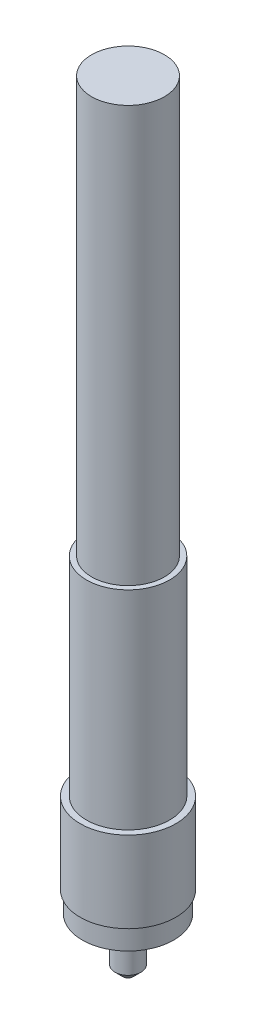
ISO-10303-21;
HEADER;
FILE_DESCRIPTION(('STEP AP214'),'2;1');
FILE_NAME('part.step','',(''),(''),'','','');
FILE_SCHEMA(('AUTOMOTIVE_DESIGN { 1 0 10303 214 1 1 1 1 }'));
ENDSEC;
DATA;
#1=APPLICATION_CONTEXT('core data for automotive mechanical design processes');
#2=APPLICATION_PROTOCOL_DEFINITION('international standard','automotive_design',2000,#1);
#3=PRODUCT_CONTEXT('',#1,'mechanical');
#4=PRODUCT('Part','Part','',(#3));
#5=PRODUCT_RELATED_PRODUCT_CATEGORY('part','',(#4));
#6=PRODUCT_DEFINITION_FORMATION('','',#4);
#7=PRODUCT_DEFINITION_CONTEXT('part definition',#1,'design');
#8=PRODUCT_DEFINITION('design','',#6,#7);
#9=PRODUCT_DEFINITION_SHAPE('','',#8);
#10=(LENGTH_UNIT() NAMED_UNIT(*) SI_UNIT(.MILLI.,.METRE.));
#11=(NAMED_UNIT(*) PLANE_ANGLE_UNIT() SI_UNIT($,.RADIAN.));
#12=(NAMED_UNIT(*) SI_UNIT($,.STERADIAN.) SOLID_ANGLE_UNIT());
#13=UNCERTAINTY_MEASURE_WITH_UNIT(LENGTH_MEASURE(1.E-05),#10,'distance_accuracy_value','');
#14=(GEOMETRIC_REPRESENTATION_CONTEXT(3) GLOBAL_UNCERTAINTY_ASSIGNED_CONTEXT((#13)) GLOBAL_UNIT_ASSIGNED_CONTEXT((#10,
#11,#12)) REPRESENTATION_CONTEXT('',''));
#15=CARTESIAN_POINT('',(0.,0.,0.));
#16=DIRECTION('',(0.,0.,1.));
#17=DIRECTION('',(1.,0.,0.));
#18=AXIS2_PLACEMENT_3D('',#15,#16,#17);
#19=CARTESIAN_POINT('',(0.,29.8,0.));
#20=DIRECTION('',(0.,1.,0.));
#21=DIRECTION('',(0.,0.,1.));
#22=AXIS2_PLACEMENT_3D('',#19,#20,#21);
#23=PLANE('',#22);
#24=CARTESIAN_POINT('',(0.,29.8,0.));
#25=DIRECTION('',(0.,1.,0.));
#26=DIRECTION('',(0.,0.,1.));
#27=AXIS2_PLACEMENT_3D('',#24,#25,#26);
#28=CIRCLE('',#27,4.);
#29=CARTESIAN_POINT('',(0.,29.8,4.));
#30=VERTEX_POINT('',#29);
#31=EDGE_CURVE('E80',#30,#30,#28,.T.);
#32=ORIENTED_EDGE('',*,*,#31,.T.);
#33=EDGE_LOOP('',(#32));
#34=FACE_BOUND('',#33,.T.);
#35=CARTESIAN_POINT('',(0.,29.8,0.));
#36=DIRECTION('',(0.,1.,0.));
#37=DIRECTION('',(0.,0.,1.));
#38=AXIS2_PLACEMENT_3D('',#35,#36,#37);
#39=CIRCLE('',#38,3.5);
#40=CARTESIAN_POINT('',(0.,29.8,3.5));
#41=VERTEX_POINT('',#40);
#42=EDGE_CURVE('E87',#41,#41,#39,.T.);
#43=ORIENTED_EDGE('',*,*,#42,.F.);
#44=EDGE_LOOP('',(#43));
#45=FACE_BOUND('',#44,.T.);
#46=ADVANCED_FACE('F33',(#34,#45),#23,.T.);
#47=CARTESIAN_POINT('',(0.,9.8,0.));
#48=DIRECTION('',(0.,1.,0.));
#49=DIRECTION('',(0.,0.,1.));
#50=AXIS2_PLACEMENT_3D('',#47,#48,#49);
#51=PLANE('',#50);
#52=CARTESIAN_POINT('',(0.,9.8,0.));
#53=DIRECTION('',(0.,1.,0.));
#54=DIRECTION('',(0.,0.,1.));
#55=AXIS2_PLACEMENT_3D('',#52,#53,#54);
#56=CIRCLE('',#55,4.6);
#57=CARTESIAN_POINT('',(0.,9.8,4.6));
#58=VERTEX_POINT('',#57);
#59=EDGE_CURVE('E44',#58,#58,#56,.T.);
#60=ORIENTED_EDGE('',*,*,#59,.T.);
#61=EDGE_LOOP('',(#60));
#62=FACE_BOUND('',#61,.T.);
#63=CARTESIAN_POINT('',(0.,9.8,0.));
#64=DIRECTION('',(0.,1.,0.));
#65=DIRECTION('',(0.,0.,1.));
#66=AXIS2_PLACEMENT_3D('',#63,#64,#65);
#67=CIRCLE('',#66,4.);
#68=CARTESIAN_POINT('',(0.,9.8,4.));
#69=VERTEX_POINT('',#68);
#70=EDGE_CURVE('E81',#69,#69,#67,.T.);
#71=ORIENTED_EDGE('',*,*,#70,.F.);
#72=EDGE_LOOP('',(#71));
#73=FACE_BOUND('',#72,.T.);
#74=ADVANCED_FACE('F103',(#62,#73),#51,.T.);
#75=CARTESIAN_POINT('',(0.,9.8,0.));
#76=DIRECTION('',(0.,-1.,0.));
#77=DIRECTION('',(0.,0.,-1.));
#78=AXIS2_PLACEMENT_3D('',#75,#76,#77);
#79=CYLINDRICAL_SURFACE('',#78,4.6);
#80=ORIENTED_EDGE('',*,*,#59,.F.);
#81=EDGE_LOOP('',(#80));
#82=FACE_BOUND('',#81,.T.);
#83=CARTESIAN_POINT('',(0.,2.,0.));
#84=DIRECTION('',(0.,-1.,0.));
#85=DIRECTION('',(0.,0.,-1.));
#86=AXIS2_PLACEMENT_3D('',#83,#84,#85);
#87=CIRCLE('',#86,4.6);
#88=CARTESIAN_POINT('',(0.,2.,-4.6));
#89=VERTEX_POINT('',#88);
#90=EDGE_CURVE('E48',#89,#89,#87,.T.);
#91=ORIENTED_EDGE('',*,*,#90,.F.);
#92=EDGE_LOOP('',(#91));
#93=FACE_BOUND('',#92,.T.);
#94=ADVANCED_FACE('F35',(#82,#93),#79,.T.);
#95=CARTESIAN_POINT('',(0.,2.,0.));
#96=DIRECTION('',(0.,-1.,0.));
#97=DIRECTION('',(0.,0.,-1.));
#98=AXIS2_PLACEMENT_3D('',#95,#96,#97);
#99=PLANE('',#98);
#100=CARTESIAN_POINT('',(0.,2.,0.));
#101=DIRECTION('',(0.,-1.,0.));
#102=DIRECTION('',(0.,0.,-1.));
#103=AXIS2_PLACEMENT_3D('',#100,#101,#102);
#104=CIRCLE('',#103,4.4);
#105=CARTESIAN_POINT('',(0.,2.,-4.4));
#106=VERTEX_POINT('',#105);
#107=EDGE_CURVE('E53',#106,#106,#104,.T.);
#108=ORIENTED_EDGE('',*,*,#107,.F.);
#109=EDGE_LOOP('',(#108));
#110=FACE_BOUND('',#109,.T.);
#111=ORIENTED_EDGE('',*,*,#90,.T.);
#112=EDGE_LOOP('',(#111));
#113=FACE_BOUND('',#112,.T.);
#114=ADVANCED_FACE('F153',(#110,#113),#99,.T.);
#115=CARTESIAN_POINT('',(0.,2.,0.));
#116=DIRECTION('',(0.,-1.,0.));
#117=DIRECTION('',(0.,0.,-1.));
#118=AXIS2_PLACEMENT_3D('',#115,#116,#117);
#119=CYLINDRICAL_SURFACE('',#118,4.4);
#120=ORIENTED_EDGE('',*,*,#107,.T.);
#121=EDGE_LOOP('',(#120));
#122=FACE_BOUND('',#121,.T.);
#123=CARTESIAN_POINT('',(0.,0.,0.));
#124=DIRECTION('',(0.,-1.,0.));
#125=DIRECTION('',(0.,0.,-1.));
#126=AXIS2_PLACEMENT_3D('',#123,#124,#125);
#127=CIRCLE('',#126,4.4);
#128=CARTESIAN_POINT('',(0.,0.,-4.4));
#129=VERTEX_POINT('',#128);
#130=EDGE_CURVE('E56',#129,#129,#127,.T.);
#131=ORIENTED_EDGE('',*,*,#130,.F.);
#132=EDGE_LOOP('',(#131));
#133=FACE_BOUND('',#132,.T.);
#134=ADVANCED_FACE('F150',(#122,#133),#119,.T.);
#135=CARTESIAN_POINT('',(0.,0.,0.));
#136=DIRECTION('',(0.,1.,0.));
#137=DIRECTION('',(0.,0.,1.));
#138=AXIS2_PLACEMENT_3D('',#135,#136,#137);
#139=PLANE('',#138);
#140=CARTESIAN_POINT('',(0.,0.,0.));
#141=DIRECTION('',(0.,-1.,0.));
#142=DIRECTION('',(0.,0.,-1.));
#143=AXIS2_PLACEMENT_3D('',#140,#141,#142);
#144=CIRCLE('',#143,3.9);
#145=CARTESIAN_POINT('',(0.,0.,-3.9));
#146=VERTEX_POINT('',#145);
#147=EDGE_CURVE('E62',#146,#146,#144,.T.);
#148=ORIENTED_EDGE('',*,*,#147,.F.);
#149=EDGE_LOOP('',(#148));
#150=FACE_BOUND('',#149,.T.);
#151=ORIENTED_EDGE('',*,*,#130,.T.);
#152=EDGE_LOOP('',(#151));
#153=FACE_BOUND('',#152,.T.);
#154=ADVANCED_FACE('F148',(#150,#153),#139,.F.);
#155=CARTESIAN_POINT('',(0.,4.,0.));
#156=DIRECTION('',(0.,-1.,0.));
#157=DIRECTION('',(0.,0.,-1.));
#158=AXIS2_PLACEMENT_3D('',#155,#156,#157);
#159=CYLINDRICAL_SURFACE('',#158,3.9);
#160=CARTESIAN_POINT('',(0.,4.,0.));
#161=DIRECTION('',(0.,-1.,0.));
#162=DIRECTION('',(0.,0.,-1.));
#163=AXIS2_PLACEMENT_3D('',#160,#161,#162);
#164=CIRCLE('',#163,3.9);
#165=CARTESIAN_POINT('',(0.,4.,-3.9));
#166=VERTEX_POINT('',#165);
#167=EDGE_CURVE('E59',#166,#166,#164,.T.);
#168=ORIENTED_EDGE('',*,*,#167,.F.);
#169=EDGE_LOOP('',(#168));
#170=FACE_BOUND('',#169,.T.);
#171=ORIENTED_EDGE('',*,*,#147,.T.);
#172=EDGE_LOOP('',(#171));
#173=FACE_BOUND('',#172,.T.);
#174=ADVANCED_FACE('F144',(#170,#173),#159,.F.);
#175=CARTESIAN_POINT('',(0.,4.,0.));
#176=DIRECTION('',(0.,-1.,0.));
#177=DIRECTION('',(0.,0.,-1.));
#178=AXIS2_PLACEMENT_3D('',#175,#176,#177);
#179=PLANE('',#178);
#180=CARTESIAN_POINT('',(0.,4.,0.));
#181=DIRECTION('',(0.,-1.,0.));
#182=DIRECTION('',(0.,0.,-1.));
#183=AXIS2_PLACEMENT_3D('',#180,#181,#182);
#184=CIRCLE('',#183,2.9);
#185=CARTESIAN_POINT('',(0.,4.,-2.9));
#186=VERTEX_POINT('',#185);
#187=EDGE_CURVE('E65',#186,#186,#184,.T.);
#188=ORIENTED_EDGE('',*,*,#187,.F.);
#189=EDGE_LOOP('',(#188));
#190=FACE_BOUND('',#189,.T.);
#191=ORIENTED_EDGE('',*,*,#167,.T.);
#192=EDGE_LOOP('',(#191));
#193=FACE_BOUND('',#192,.T.);
#194=ADVANCED_FACE('F140',(#190,#193),#179,.T.);
#195=CARTESIAN_POINT('',(0.,4.,0.));
#196=DIRECTION('',(0.,-1.,0.));
#197=DIRECTION('',(0.,0.,-1.));
#198=AXIS2_PLACEMENT_3D('',#195,#196,#197);
#199=CYLINDRICAL_SURFACE('',#198,2.9);
#200=ORIENTED_EDGE('',*,*,#187,.T.);
#201=EDGE_LOOP('',(#200));
#202=FACE_BOUND('',#201,.T.);
#203=CARTESIAN_POINT('',(0.,-1.,0.));
#204=DIRECTION('',(0.,-1.,0.));
#205=DIRECTION('',(0.,0.,-1.));
#206=AXIS2_PLACEMENT_3D('',#203,#204,#205);
#207=CIRCLE('',#206,2.9);
#208=CARTESIAN_POINT('',(0.,-1.,-2.9));
#209=VERTEX_POINT('',#208);
#210=EDGE_CURVE('E74',#209,#209,#207,.T.);
#211=ORIENTED_EDGE('',*,*,#210,.F.);
#212=EDGE_LOOP('',(#211));
#213=FACE_BOUND('',#212,.T.);
#214=ADVANCED_FACE('F120',(#202,#213),#199,.T.);
#215=CARTESIAN_POINT('',(0.,-1.,0.));
#216=DIRECTION('',(0.,-1.,0.));
#217=DIRECTION('',(0.,0.,-1.));
#218=AXIS2_PLACEMENT_3D('',#215,#216,#217);
#219=PLANE('',#218);
#220=ORIENTED_EDGE('',*,*,#210,.T.);
#221=EDGE_LOOP('',(#220));
#222=FACE_BOUND('',#221,.T.);
#223=CARTESIAN_POINT('',(0.,-1.,0.));
#224=DIRECTION('',(0.,-1.,0.));
#225=DIRECTION('',(0.,0.,-1.));
#226=AXIS2_PLACEMENT_3D('',#223,#224,#225);
#227=CIRCLE('',#226,2.4);
#228=CARTESIAN_POINT('',(0.,-1.,-2.4));
#229=VERTEX_POINT('',#228);
#230=EDGE_CURVE('E77',#229,#229,#227,.T.);
#231=ORIENTED_EDGE('',*,*,#230,.F.);
#232=EDGE_LOOP('',(#231));
#233=FACE_BOUND('',#232,.T.);
#234=ADVANCED_FACE('F116',(#222,#233),#219,.T.);
#235=CARTESIAN_POINT('',(0.,-5.,0.));
#236=DIRECTION('',(0.,-1.,0.));
#237=DIRECTION('',(0.,0.,-1.));
#238=AXIS2_PLACEMENT_3D('',#235,#236,#237);
#239=PLANE('',#238);
#240=CARTESIAN_POINT('',(0.,-5.,0.));
#241=DIRECTION('',(0.,-1.,0.));
#242=DIRECTION('',(0.,0.,-1.));
#243=AXIS2_PLACEMENT_3D('',#240,#241,#242);
#244=CIRCLE('',#243,0.5);
#245=CARTESIAN_POINT('',(0.,-5.,-0.5));
#246=VERTEX_POINT('',#245);
#247=EDGE_CURVE('E40',#246,#246,#244,.T.);
#248=ORIENTED_EDGE('',*,*,#247,.T.);
#249=EDGE_LOOP('',(#248));
#250=FACE_BOUND('',#249,.T.);
#251=ADVANCED_FACE('F119',(#250),#239,.T.);
#252=CARTESIAN_POINT('',(0.,-5.,0.));
#253=DIRECTION('',(0.,1.,0.));
#254=DIRECTION('',(0.,0.,1.));
#255=AXIS2_PLACEMENT_3D('',#252,#253,#254);
#256=CONICAL_SURFACE('',#255,0.5,0.785398163397445);
#257=CARTESIAN_POINT('',(0.,-4.25,0.));
#258=DIRECTION('',(0.,-1.,0.));
#259=DIRECTION('',(0.,0.,-1.));
#260=AXIS2_PLACEMENT_3D('',#257,#258,#259);
#261=CIRCLE('',#260,1.25);
#262=CARTESIAN_POINT('',(0.,-4.25,-1.25));
#263=VERTEX_POINT('',#262);
#264=EDGE_CURVE('E10',#263,#263,#261,.F.);
#265=ORIENTED_EDGE('',*,*,#264,.F.);
#266=EDGE_LOOP('',(#265));
#267=FACE_BOUND('',#266,.T.);
#268=ORIENTED_EDGE('',*,*,#247,.F.);
#269=EDGE_LOOP('',(#268));
#270=FACE_BOUND('',#269,.T.);
#271=ADVANCED_FACE('F122',(#267,#270),#256,.T.);
#272=CARTESIAN_POINT('',(0.,-5.,0.));
#273=DIRECTION('',(0.,1.,0.));
#274=DIRECTION('',(0.,0.,1.));
#275=AXIS2_PLACEMENT_3D('',#272,#273,#274);
#276=CYLINDRICAL_SURFACE('',#275,1.25);
#277=ORIENTED_EDGE('',*,*,#264,.T.);
#278=EDGE_LOOP('',(#277));
#279=FACE_BOUND('',#278,.T.);
#280=CARTESIAN_POINT('',(0.,5.,0.));
#281=DIRECTION('',(0.,-1.,0.));
#282=DIRECTION('',(0.,0.,-1.));
#283=AXIS2_PLACEMENT_3D('',#280,#281,#282);
#284=CIRCLE('',#283,1.25);
#285=CARTESIAN_POINT('',(0.,5.,-1.25));
#286=VERTEX_POINT('',#285);
#287=EDGE_CURVE('E71',#286,#286,#284,.T.);
#288=ORIENTED_EDGE('',*,*,#287,.T.);
#289=EDGE_LOOP('',(#288));
#290=FACE_BOUND('',#289,.T.);
#291=ADVANCED_FACE('F125',(#279,#290),#276,.T.);
#292=CARTESIAN_POINT('',(0.,5.,0.));
#293=DIRECTION('',(0.,-1.,0.));
#294=DIRECTION('',(0.,0.,-1.));
#295=AXIS2_PLACEMENT_3D('',#292,#293,#294);
#296=PLANE('',#295);
#297=CARTESIAN_POINT('',(0.,5.,0.));
#298=DIRECTION('',(0.,-1.,0.));
#299=DIRECTION('',(0.,0.,-1.));
#300=AXIS2_PLACEMENT_3D('',#297,#298,#299);
#301=CIRCLE('',#300,2.4);
#302=CARTESIAN_POINT('',(0.,5.,-2.4));
#303=VERTEX_POINT('',#302);
#304=EDGE_CURVE('E68',#303,#303,#301,.T.);
#305=ORIENTED_EDGE('',*,*,#304,.T.);
#306=EDGE_LOOP('',(#305));
#307=FACE_BOUND('',#306,.T.);
#308=ORIENTED_EDGE('',*,*,#287,.F.);
#309=EDGE_LOOP('',(#308));
#310=FACE_BOUND('',#309,.T.);
#311=ADVANCED_FACE('F131',(#307,#310),#296,.T.);
#312=CARTESIAN_POINT('',(0.,5.,0.));
#313=DIRECTION('',(0.,-1.,0.));
#314=DIRECTION('',(0.,0.,-1.));
#315=AXIS2_PLACEMENT_3D('',#312,#313,#314);
#316=CYLINDRICAL_SURFACE('',#315,2.4);
#317=ORIENTED_EDGE('',*,*,#304,.F.);
#318=EDGE_LOOP('',(#317));
#319=FACE_BOUND('',#318,.T.);
#320=ORIENTED_EDGE('',*,*,#230,.T.);
#321=EDGE_LOOP('',(#320));
#322=FACE_BOUND('',#321,.T.);
#323=ADVANCED_FACE('F114',(#319,#322),#316,.F.);
#324=CARTESIAN_POINT('',(0.,29.8,0.));
#325=DIRECTION('',(0.,-1.,0.));
#326=DIRECTION('',(0.,0.,-1.));
#327=AXIS2_PLACEMENT_3D('',#324,#325,#326);
#328=CYLINDRICAL_SURFACE('',#327,4.);
#329=ORIENTED_EDGE('',*,*,#31,.F.);
#330=EDGE_LOOP('',(#329));
#331=FACE_BOUND('',#330,.T.);
#332=ORIENTED_EDGE('',*,*,#70,.T.);
#333=EDGE_LOOP('',(#332));
#334=FACE_BOUND('',#333,.T.);
#335=ADVANCED_FACE('F98',(#331,#334),#328,.T.);
#336=CARTESIAN_POINT('',(0.,69.8,0.));
#337=DIRECTION('',(0.,-1.,0.));
#338=DIRECTION('',(0.,0.,-1.));
#339=AXIS2_PLACEMENT_3D('',#336,#337,#338);
#340=CYLINDRICAL_SURFACE('',#339,3.5);
#341=CARTESIAN_POINT('',(0.,69.8,0.));
#342=DIRECTION('',(0.,1.,0.));
#343=DIRECTION('',(0.,0.,1.));
#344=AXIS2_PLACEMENT_3D('',#341,#342,#343);
#345=CIRCLE('',#344,3.5);
#346=CARTESIAN_POINT('',(0.,69.8,3.5));
#347=VERTEX_POINT('',#346);
#348=EDGE_CURVE('E84',#347,#347,#345,.T.);
#349=ORIENTED_EDGE('',*,*,#348,.F.);
#350=EDGE_LOOP('',(#349));
#351=FACE_BOUND('',#350,.T.);
#352=ORIENTED_EDGE('',*,*,#42,.T.);
#353=EDGE_LOOP('',(#352));
#354=FACE_BOUND('',#353,.T.);
#355=ADVANCED_FACE('F95',(#351,#354),#340,.T.);
#356=CARTESIAN_POINT('',(0.,69.8,0.));
#357=DIRECTION('',(0.,1.,0.));
#358=DIRECTION('',(0.,0.,1.));
#359=AXIS2_PLACEMENT_3D('',#356,#357,#358);
#360=PLANE('',#359);
#361=ORIENTED_EDGE('',*,*,#348,.T.);
#362=EDGE_LOOP('',(#361));
#363=FACE_BOUND('',#362,.T.);
#364=ADVANCED_FACE('F93',(#363),#360,.T.);
#365=CLOSED_SHELL('',(#46,#74,#94,#114,#134,#154,#174,#194,#214,#234,#251,#271,#291,#311,#323,
#335,#355,#364));
#366=MANIFOLD_SOLID_BREP('B2',#365);
#367=ADVANCED_BREP_SHAPE_REPRESENTATION('',(#18,#366),#14);
#368=SHAPE_DEFINITION_REPRESENTATION(#9,#367);
ENDSEC;
END-ISO-10303-21;
